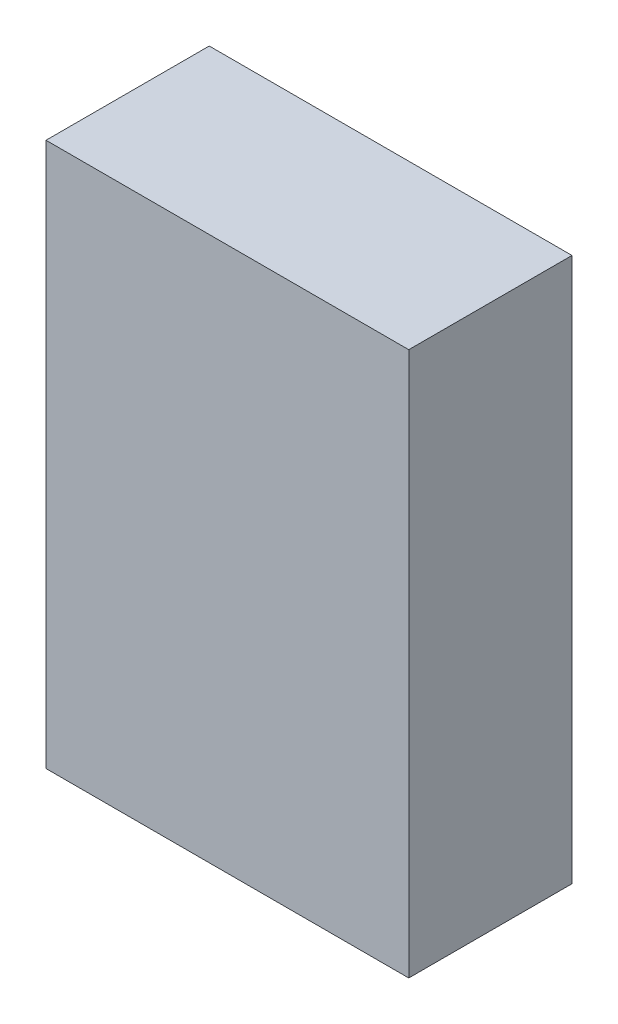
ISO-10303-21;
HEADER;
FILE_DESCRIPTION(('STEP AP214'),'2;1');
FILE_NAME('part.step','',(''),(''),'','','');
FILE_SCHEMA(('AUTOMOTIVE_DESIGN { 1 0 10303 214 1 1 1 1 }'));
ENDSEC;
DATA;
#1=APPLICATION_CONTEXT('core data for automotive mechanical design processes');
#2=APPLICATION_PROTOCOL_DEFINITION('international standard','automotive_design',2000,#1);
#3=PRODUCT_CONTEXT('',#1,'mechanical');
#4=PRODUCT('Part','Part','',(#3));
#5=PRODUCT_RELATED_PRODUCT_CATEGORY('part','',(#4));
#6=PRODUCT_DEFINITION_FORMATION('','',#4);
#7=PRODUCT_DEFINITION_CONTEXT('part definition',#1,'design');
#8=PRODUCT_DEFINITION('design','',#6,#7);
#9=PRODUCT_DEFINITION_SHAPE('','',#8);
#10=(LENGTH_UNIT() NAMED_UNIT(*) SI_UNIT(.MILLI.,.METRE.));
#11=(NAMED_UNIT(*) PLANE_ANGLE_UNIT() SI_UNIT($,.RADIAN.));
#12=(NAMED_UNIT(*) SI_UNIT($,.STERADIAN.) SOLID_ANGLE_UNIT());
#13=UNCERTAINTY_MEASURE_WITH_UNIT(LENGTH_MEASURE(1.E-05),#10,'distance_accuracy_value','');
#14=(GEOMETRIC_REPRESENTATION_CONTEXT(3) GLOBAL_UNCERTAINTY_ASSIGNED_CONTEXT((#13)) GLOBAL_UNIT_ASSIGNED_CONTEXT((#10,
#11,#12)) REPRESENTATION_CONTEXT('',''));
#15=CARTESIAN_POINT('',(0.,0.,0.));
#16=DIRECTION('',(0.,0.,1.));
#17=DIRECTION('',(1.,0.,0.));
#18=AXIS2_PLACEMENT_3D('',#15,#16,#17);
#19=CARTESIAN_POINT('',(63.5,95.25,57.15));
#20=DIRECTION('',(-1.,0.,0.));
#21=DIRECTION('',(0.,-1.,0.));
#22=AXIS2_PLACEMENT_3D('',#19,#20,#21);
#23=PLANE('',#22);
#24=DIRECTION('',(0.,1.,0.));
#25=VECTOR('',#24,1.);
#26=CARTESIAN_POINT('',(63.5,95.25,0.));
#27=LINE('',#26,#25);
#28=CARTESIAN_POINT('',(63.5,-95.25,0.));
#29=VERTEX_POINT('',#28);
#30=CARTESIAN_POINT('',(63.5,95.25,0.));
#31=VERTEX_POINT('',#30);
#32=EDGE_CURVE('E98',#29,#31,#27,.T.);
#33=ORIENTED_EDGE('',*,*,#32,.T.);
#34=DIRECTION('',(0.,0.,-1.));
#35=VECTOR('',#34,1.);
#36=CARTESIAN_POINT('',(63.5,95.25,57.15));
#37=LINE('',#36,#35);
#38=CARTESIAN_POINT('',(63.5,95.25,57.15));
#39=VERTEX_POINT('',#38);
#40=EDGE_CURVE('E11',#39,#31,#37,.T.);
#41=ORIENTED_EDGE('',*,*,#40,.F.);
#42=DIRECTION('',(0.,1.,0.));
#43=VECTOR('',#42,1.);
#44=CARTESIAN_POINT('',(63.5,95.25,57.15));
#45=LINE('',#44,#43);
#46=CARTESIAN_POINT('',(63.5,-95.25,57.15));
#47=VERTEX_POINT('',#46);
#48=EDGE_CURVE('E86',#47,#39,#45,.T.);
#49=ORIENTED_EDGE('',*,*,#48,.F.);
#50=DIRECTION('',(0.,0.,-1.));
#51=VECTOR('',#50,1.);
#52=CARTESIAN_POINT('',(63.5,-95.25,57.15));
#53=LINE('',#52,#51);
#54=EDGE_CURVE('E94',#47,#29,#53,.T.);
#55=ORIENTED_EDGE('',*,*,#54,.T.);
#56=EDGE_LOOP('',(#33,#41,#49,#55));
#57=FACE_BOUND('',#56,.T.);
#58=ADVANCED_FACE('F35',(#57),#23,.F.);
#59=CARTESIAN_POINT('',(-63.5,95.25,57.15));
#60=DIRECTION('',(0.,-1.,0.));
#61=DIRECTION('',(0.,0.,-1.));
#62=AXIS2_PLACEMENT_3D('',#59,#60,#61);
#63=PLANE('',#62);
#64=DIRECTION('',(-1.,0.,0.));
#65=VECTOR('',#64,1.);
#66=CARTESIAN_POINT('',(-63.5,95.25,0.));
#67=LINE('',#66,#65);
#68=CARTESIAN_POINT('',(-63.5,95.25,0.));
#69=VERTEX_POINT('',#68);
#70=EDGE_CURVE('E90',#31,#69,#67,.T.);
#71=ORIENTED_EDGE('',*,*,#70,.T.);
#72=DIRECTION('',(0.,0.,-1.));
#73=VECTOR('',#72,1.);
#74=CARTESIAN_POINT('',(-63.5,95.25,57.15));
#75=LINE('',#74,#73);
#76=CARTESIAN_POINT('',(-63.5,95.25,57.15));
#77=VERTEX_POINT('',#76);
#78=EDGE_CURVE('E43',#77,#69,#75,.T.);
#79=ORIENTED_EDGE('',*,*,#78,.F.);
#80=DIRECTION('',(-1.,0.,0.));
#81=VECTOR('',#80,1.);
#82=CARTESIAN_POINT('',(-63.5,95.25,57.15));
#83=LINE('',#82,#81);
#84=EDGE_CURVE('E81',#39,#77,#83,.T.);
#85=ORIENTED_EDGE('',*,*,#84,.F.);
#86=ORIENTED_EDGE('',*,*,#40,.T.);
#87=EDGE_LOOP('',(#71,#79,#85,#86));
#88=FACE_BOUND('',#87,.T.);
#89=ADVANCED_FACE('F89',(#88),#63,.F.);
#90=CARTESIAN_POINT('',(-63.5,95.25,57.15));
#91=DIRECTION('',(1.,0.,0.));
#92=DIRECTION('',(0.,1.,0.));
#93=AXIS2_PLACEMENT_3D('',#90,#91,#92);
#94=PLANE('',#93);
#95=DIRECTION('',(0.,-1.,0.));
#96=VECTOR('',#95,1.);
#97=CARTESIAN_POINT('',(-63.5,95.25,0.));
#98=LINE('',#97,#96);
#99=CARTESIAN_POINT('',(-63.5,-95.25,0.));
#100=VERTEX_POINT('',#99);
#101=EDGE_CURVE('E68',#69,#100,#98,.T.);
#102=ORIENTED_EDGE('',*,*,#101,.T.);
#103=DIRECTION('',(0.,0.,-1.));
#104=VECTOR('',#103,1.);
#105=CARTESIAN_POINT('',(-63.5,-95.25,57.15));
#106=LINE('',#105,#104);
#107=CARTESIAN_POINT('',(-63.5,-95.25,57.15));
#108=VERTEX_POINT('',#107);
#109=EDGE_CURVE('E91',#108,#100,#106,.T.);
#110=ORIENTED_EDGE('',*,*,#109,.F.);
#111=DIRECTION('',(0.,-1.,0.));
#112=VECTOR('',#111,1.);
#113=CARTESIAN_POINT('',(-63.5,95.25,57.15));
#114=LINE('',#113,#112);
#115=EDGE_CURVE('E84',#77,#108,#114,.T.);
#116=ORIENTED_EDGE('',*,*,#115,.F.);
#117=ORIENTED_EDGE('',*,*,#78,.T.);
#118=EDGE_LOOP('',(#102,#110,#116,#117));
#119=FACE_BOUND('',#118,.T.);
#120=ADVANCED_FACE('F92',(#119),#94,.F.);
#121=CARTESIAN_POINT('',(-63.5,-95.25,57.15));
#122=DIRECTION('',(0.,1.,0.));
#123=DIRECTION('',(0.,0.,1.));
#124=AXIS2_PLACEMENT_3D('',#121,#122,#123);
#125=PLANE('',#124);
#126=DIRECTION('',(1.,0.,0.));
#127=VECTOR('',#126,1.);
#128=CARTESIAN_POINT('',(-63.5,-95.25,0.));
#129=LINE('',#128,#127);
#130=EDGE_CURVE('E74',#100,#29,#129,.T.);
#131=ORIENTED_EDGE('',*,*,#130,.T.);
#132=ORIENTED_EDGE('',*,*,#54,.F.);
#133=DIRECTION('',(1.,0.,0.));
#134=VECTOR('',#133,1.);
#135=CARTESIAN_POINT('',(-63.5,-95.25,57.15));
#136=LINE('',#135,#134);
#137=EDGE_CURVE('E51',#108,#47,#136,.T.);
#138=ORIENTED_EDGE('',*,*,#137,.F.);
#139=ORIENTED_EDGE('',*,*,#109,.T.);
#140=EDGE_LOOP('',(#131,#132,#138,#139));
#141=FACE_BOUND('',#140,.T.);
#142=ADVANCED_FACE('F105',(#141),#125,.F.);
#143=CARTESIAN_POINT('',(0.,0.,57.15));
#144=DIRECTION('',(0.,0.,1.));
#145=DIRECTION('',(1.,0.,0.));
#146=AXIS2_PLACEMENT_3D('',#143,#144,#145);
#147=PLANE('',#146);
#148=ORIENTED_EDGE('',*,*,#48,.T.);
#149=ORIENTED_EDGE('',*,*,#84,.T.);
#150=ORIENTED_EDGE('',*,*,#115,.T.);
#151=ORIENTED_EDGE('',*,*,#137,.T.);
#152=EDGE_LOOP('',(#148,#149,#150,#151));
#153=FACE_BOUND('',#152,.T.);
#154=ADVANCED_FACE('F82',(#153),#147,.T.);
#155=CARTESIAN_POINT('',(0.,0.,0.));
#156=DIRECTION('',(0.,0.,1.));
#157=DIRECTION('',(1.,0.,0.));
#158=AXIS2_PLACEMENT_3D('',#155,#156,#157);
#159=PLANE('',#158);
#160=ORIENTED_EDGE('',*,*,#32,.F.);
#161=ORIENTED_EDGE('',*,*,#130,.F.);
#162=ORIENTED_EDGE('',*,*,#101,.F.);
#163=ORIENTED_EDGE('',*,*,#70,.F.);
#164=EDGE_LOOP('',(#160,#161,#162,#163));
#165=FACE_BOUND('',#164,.T.);
#166=ADVANCED_FACE('F108',(#165),#159,.F.);
#167=CLOSED_SHELL('',(#58,#89,#120,#142,#154,#166));
#168=MANIFOLD_SOLID_BREP('B2',#167);
#169=ADVANCED_BREP_SHAPE_REPRESENTATION('',(#18,#168),#14);
#170=SHAPE_DEFINITION_REPRESENTATION(#9,#169);
ENDSEC;
END-ISO-10303-21;
